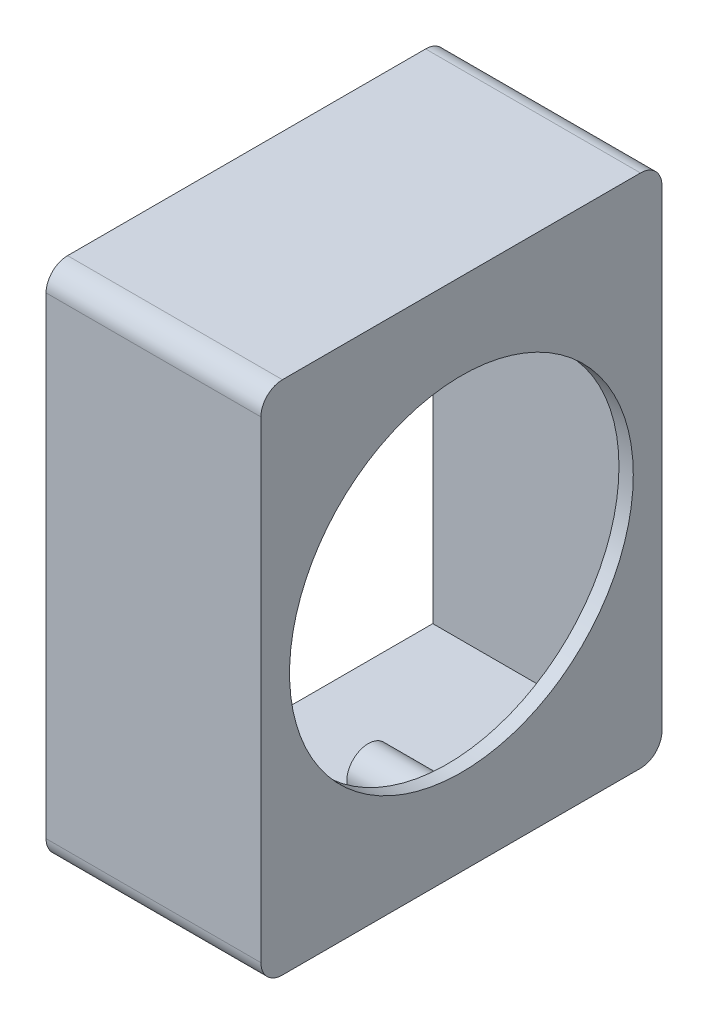
ISO-10303-21;
HEADER;
FILE_DESCRIPTION(('STEP AP214'),'2;1');
FILE_NAME('part.step','',(''),(''),'','','');
FILE_SCHEMA(('AUTOMOTIVE_DESIGN { 1 0 10303 214 1 1 1 1 }'));
ENDSEC;
DATA;
#1=APPLICATION_CONTEXT('core data for automotive mechanical design processes');
#2=APPLICATION_PROTOCOL_DEFINITION('international standard','automotive_design',2000,#1);
#3=PRODUCT_CONTEXT('',#1,'mechanical');
#4=PRODUCT('Part','Part','',(#3));
#5=PRODUCT_RELATED_PRODUCT_CATEGORY('part','',(#4));
#6=PRODUCT_DEFINITION_FORMATION('','',#4);
#7=PRODUCT_DEFINITION_CONTEXT('part definition',#1,'design');
#8=PRODUCT_DEFINITION('design','',#6,#7);
#9=PRODUCT_DEFINITION_SHAPE('','',#8);
#10=(LENGTH_UNIT() NAMED_UNIT(*) SI_UNIT(.MILLI.,.METRE.));
#11=(NAMED_UNIT(*) PLANE_ANGLE_UNIT() SI_UNIT($,.RADIAN.));
#12=(NAMED_UNIT(*) SI_UNIT($,.STERADIAN.) SOLID_ANGLE_UNIT());
#13=UNCERTAINTY_MEASURE_WITH_UNIT(LENGTH_MEASURE(1.E-05),#10,'distance_accuracy_value','');
#14=(GEOMETRIC_REPRESENTATION_CONTEXT(3) GLOBAL_UNCERTAINTY_ASSIGNED_CONTEXT((#13)) GLOBAL_UNIT_ASSIGNED_CONTEXT((#10,
#11,#12)) REPRESENTATION_CONTEXT('',''));
#15=CARTESIAN_POINT('',(0.,0.,0.));
#16=DIRECTION('',(0.,0.,1.));
#17=DIRECTION('',(1.,0.,0.));
#18=AXIS2_PLACEMENT_3D('',#15,#16,#17);
#19=CARTESIAN_POINT('',(0.,0.,0.));
#20=DIRECTION('',(-1.,0.,0.));
#21=DIRECTION('',(0.,0.,1.));
#22=AXIS2_PLACEMENT_3D('',#19,#20,#21);
#23=PLANE('',#22);
#24=CARTESIAN_POINT('',(0.,14.5,3.5));
#25=DIRECTION('',(-1.,0.,0.));
#26=DIRECTION('',(0.,0.,-1.));
#27=AXIS2_PLACEMENT_3D('',#24,#25,#26);
#28=CIRCLE('',#27,1.5);
#29=CARTESIAN_POINT('',(0.,14.5,2.));
#30=VERTEX_POINT('',#29);
#31=EDGE_CURVE('E274',#30,#30,#28,.T.);
#32=ORIENTED_EDGE('',*,*,#31,.F.);
#33=EDGE_LOOP('',(#32));
#34=FACE_BOUND('',#33,.T.);
#35=CARTESIAN_POINT('',(0.,-14.5,3.5));
#36=DIRECTION('',(-1.,0.,0.));
#37=DIRECTION('',(0.,0.,1.));
#38=AXIS2_PLACEMENT_3D('',#35,#36,#37);
#39=CIRCLE('',#38,1.5);
#40=CARTESIAN_POINT('',(0.,-14.5,5.));
#41=VERTEX_POINT('',#40);
#42=EDGE_CURVE('E11',#41,#41,#39,.T.);
#43=ORIENTED_EDGE('',*,*,#42,.F.);
#44=EDGE_LOOP('',(#43));
#45=FACE_BOUND('',#44,.T.);
#46=CARTESIAN_POINT('',(0.,0.,3.));
#47=DIRECTION('',(1.,0.,0.));
#48=DIRECTION('',(0.,0.,-1.));
#49=AXIS2_PLACEMENT_3D('',#46,#47,#48);
#50=CIRCLE('',#49,12.);
#51=CARTESIAN_POINT('',(0.,0.,-9.));
#52=VERTEX_POINT('',#51);
#53=EDGE_CURVE('E244',#52,#52,#50,.T.);
#54=ORIENTED_EDGE('',*,*,#53,.T.);
#55=EDGE_LOOP('',(#54));
#56=FACE_BOUND('',#55,.T.);
#57=DIRECTION('',(0.,0.,1.));
#58=VECTOR('',#57,1.);
#59=CARTESIAN_POINT('',(0.,17.,0.));
#60=LINE('',#59,#58);
#61=CARTESIAN_POINT('',(0.,17.,-10.));
#62=VERTEX_POINT('',#61);
#63=CARTESIAN_POINT('',(0.,17.,16.));
#64=VERTEX_POINT('',#63);
#65=EDGE_CURVE('E145',#62,#64,#60,.T.);
#66=ORIENTED_EDGE('',*,*,#65,.F.);
#67=DIRECTION('',(0.,1.,0.));
#68=VECTOR('',#67,1.);
#69=CARTESIAN_POINT('',(0.,-18.,-10.));
#70=LINE('',#69,#68);
#71=CARTESIAN_POINT('',(0.,-17.,-10.));
#72=VERTEX_POINT('',#71);
#73=EDGE_CURVE('E131',#72,#62,#70,.T.);
#74=ORIENTED_EDGE('',*,*,#73,.F.);
#75=DIRECTION('',(0.,0.,-1.));
#76=VECTOR('',#75,1.);
#77=CARTESIAN_POINT('',(0.,-17.,0.));
#78=LINE('',#77,#76);
#79=CARTESIAN_POINT('',(0.,-17.,16.));
#80=VERTEX_POINT('',#79);
#81=EDGE_CURVE('E144',#80,#72,#78,.T.);
#82=ORIENTED_EDGE('',*,*,#81,.F.);
#83=DIRECTION('',(0.,-1.,0.));
#84=VECTOR('',#83,1.);
#85=CARTESIAN_POINT('',(0.,0.,16.));
#86=LINE('',#85,#84);
#87=EDGE_CURVE('E152',#64,#80,#86,.T.);
#88=ORIENTED_EDGE('',*,*,#87,.F.);
#89=EDGE_LOOP('',(#66,#74,#82,#88));
#90=FACE_BOUND('',#89,.T.);
#91=ADVANCED_FACE('F39',(#34,#45,#56,#90),#23,.T.);
#92=CARTESIAN_POINT('',(-14.,17.,17.));
#93=DIRECTION('',(0.,-1.,0.));
#94=DIRECTION('',(0.,0.,-1.));
#95=AXIS2_PLACEMENT_3D('',#92,#93,#94);
#96=PLANE('',#95);
#97=DIRECTION('',(0.,0.,-1.));
#98=VECTOR('',#97,1.);
#99=CARTESIAN_POINT('',(-14.,17.,17.));
#100=LINE('',#99,#98);
#101=CARTESIAN_POINT('',(-14.,17.,16.));
#102=VERTEX_POINT('',#101);
#103=CARTESIAN_POINT('',(-14.,17.,-10.));
#104=VERTEX_POINT('',#103);
#105=EDGE_CURVE('E258',#102,#104,#100,.T.);
#106=ORIENTED_EDGE('',*,*,#105,.T.);
#107=DIRECTION('',(1.,0.,0.));
#108=VECTOR('',#107,1.);
#109=CARTESIAN_POINT('',(-14.,17.,-10.));
#110=LINE('',#109,#108);
#111=EDGE_CURVE('E138',#104,#62,#110,.T.);
#112=ORIENTED_EDGE('',*,*,#111,.T.);
#113=ORIENTED_EDGE('',*,*,#65,.T.);
#114=DIRECTION('',(1.,0.,0.));
#115=VECTOR('',#114,1.);
#116=CARTESIAN_POINT('',(-14.,17.,16.));
#117=LINE('',#116,#115);
#118=EDGE_CURVE('E239',#102,#64,#117,.T.);
#119=ORIENTED_EDGE('',*,*,#118,.F.);
#120=EDGE_LOOP('',(#106,#112,#113,#119));
#121=FACE_BOUND('',#120,.T.);
#122=ADVANCED_FACE('F298',(#121),#96,.T.);
#123=CARTESIAN_POINT('',(-14.,-17.,-17.));
#124=DIRECTION('',(0.,1.,0.));
#125=DIRECTION('',(0.,0.,1.));
#126=AXIS2_PLACEMENT_3D('',#123,#124,#125);
#127=PLANE('',#126);
#128=ORIENTED_EDGE('',*,*,#81,.T.);
#129=DIRECTION('',(-1.,0.,0.));
#130=VECTOR('',#129,1.);
#131=CARTESIAN_POINT('',(-14.,-17.,-10.));
#132=LINE('',#131,#130);
#133=CARTESIAN_POINT('',(-14.,-17.,-10.));
#134=VERTEX_POINT('',#133);
#135=EDGE_CURVE('E128',#72,#134,#132,.T.);
#136=ORIENTED_EDGE('',*,*,#135,.T.);
#137=DIRECTION('',(0.,0.,1.));
#138=VECTOR('',#137,1.);
#139=CARTESIAN_POINT('',(-14.,-17.,-17.));
#140=LINE('',#139,#138);
#141=CARTESIAN_POINT('',(-14.,-17.,16.));
#142=VERTEX_POINT('',#141);
#143=EDGE_CURVE('E228',#134,#142,#140,.T.);
#144=ORIENTED_EDGE('',*,*,#143,.T.);
#145=DIRECTION('',(1.,0.,0.));
#146=VECTOR('',#145,1.);
#147=CARTESIAN_POINT('',(-14.,-17.,16.));
#148=LINE('',#147,#146);
#149=EDGE_CURVE('E151',#142,#80,#148,.T.);
#150=ORIENTED_EDGE('',*,*,#149,.T.);
#151=EDGE_LOOP('',(#128,#136,#144,#150));
#152=FACE_BOUND('',#151,.T.);
#153=ADVANCED_FACE('F149',(#152),#127,.T.);
#154=CARTESIAN_POINT('',(1.,18.,17.));
#155=DIRECTION('',(0.,1.,0.));
#156=DIRECTION('',(0.,0.,1.));
#157=AXIS2_PLACEMENT_3D('',#154,#155,#156);
#158=PLANE('',#157);
#159=DIRECTION('',(0.,0.,-1.));
#160=VECTOR('',#159,1.);
#161=CARTESIAN_POINT('',(-14.,18.,17.));
#162=LINE('',#161,#160);
#163=CARTESIAN_POINT('',(-14.,18.,15.5));
#164=VERTEX_POINT('',#163);
#165=CARTESIAN_POINT('',(-14.,18.,-9.5));
#166=VERTEX_POINT('',#165);
#167=EDGE_CURVE('E233',#164,#166,#162,.T.);
#168=ORIENTED_EDGE('',*,*,#167,.F.);
#169=DIRECTION('',(-1.,0.,0.));
#170=VECTOR('',#169,1.);
#171=CARTESIAN_POINT('',(1.,18.,15.5));
#172=LINE('',#171,#170);
#173=CARTESIAN_POINT('',(1.,18.,15.5));
#174=VERTEX_POINT('',#173);
#175=EDGE_CURVE('E61',#164,#174,#172,.F.);
#176=ORIENTED_EDGE('',*,*,#175,.T.);
#177=DIRECTION('',(0.,0.,-1.));
#178=VECTOR('',#177,1.);
#179=CARTESIAN_POINT('',(1.,18.,17.));
#180=LINE('',#179,#178);
#181=CARTESIAN_POINT('',(1.,18.,-9.5));
#182=VERTEX_POINT('',#181);
#183=EDGE_CURVE('E247',#174,#182,#180,.T.);
#184=ORIENTED_EDGE('',*,*,#183,.T.);
#185=DIRECTION('',(1.,0.,0.));
#186=VECTOR('',#185,1.);
#187=CARTESIAN_POINT('',(-14.,18.,-9.5));
#188=LINE('',#187,#186);
#189=EDGE_CURVE('E191',#182,#166,#188,.F.);
#190=ORIENTED_EDGE('',*,*,#189,.T.);
#191=EDGE_LOOP('',(#168,#176,#184,#190));
#192=FACE_BOUND('',#191,.T.);
#193=ADVANCED_FACE('F256',(#192),#158,.T.);
#194=CARTESIAN_POINT('',(1.,-18.,17.));
#195=DIRECTION('',(0.,0.,1.));
#196=DIRECTION('',(1.,0.,0.));
#197=AXIS2_PLACEMENT_3D('',#194,#195,#196);
#198=PLANE('',#197);
#199=DIRECTION('',(0.,1.,0.));
#200=VECTOR('',#199,1.);
#201=CARTESIAN_POINT('',(-14.,-18.,17.));
#202=LINE('',#201,#200);
#203=CARTESIAN_POINT('',(-14.,-16.5,17.));
#204=VERTEX_POINT('',#203);
#205=CARTESIAN_POINT('',(-14.,16.5,17.));
#206=VERTEX_POINT('',#205);
#207=EDGE_CURVE('E229',#204,#206,#202,.T.);
#208=ORIENTED_EDGE('',*,*,#207,.F.);
#209=DIRECTION('',(-1.,0.,0.));
#210=VECTOR('',#209,1.);
#211=CARTESIAN_POINT('',(1.,-16.5,17.));
#212=LINE('',#211,#210);
#213=CARTESIAN_POINT('',(1.,-16.5,17.));
#214=VERTEX_POINT('',#213);
#215=EDGE_CURVE('E182',#204,#214,#212,.F.);
#216=ORIENTED_EDGE('',*,*,#215,.T.);
#217=DIRECTION('',(0.,1.,0.));
#218=VECTOR('',#217,1.);
#219=CARTESIAN_POINT('',(1.,-18.,17.));
#220=LINE('',#219,#218);
#221=CARTESIAN_POINT('',(1.,16.5,17.));
#222=VERTEX_POINT('',#221);
#223=EDGE_CURVE('E157',#214,#222,#220,.T.);
#224=ORIENTED_EDGE('',*,*,#223,.T.);
#225=DIRECTION('',(-1.,0.,0.));
#226=VECTOR('',#225,1.);
#227=CARTESIAN_POINT('',(1.,16.5,17.));
#228=LINE('',#227,#226);
#229=EDGE_CURVE('E179',#222,#206,#228,.T.);
#230=ORIENTED_EDGE('',*,*,#229,.T.);
#231=EDGE_LOOP('',(#208,#216,#224,#230));
#232=FACE_BOUND('',#231,.T.);
#233=ADVANCED_FACE('F252',(#232),#198,.T.);
#234=CARTESIAN_POINT('',(1.,-18.,17.));
#235=DIRECTION('',(0.,1.,0.));
#236=DIRECTION('',(0.,0.,1.));
#237=AXIS2_PLACEMENT_3D('',#234,#235,#236);
#238=PLANE('',#237);
#239=DIRECTION('',(0.,0.,-1.));
#240=VECTOR('',#239,1.);
#241=CARTESIAN_POINT('',(1.,-18.,17.));
#242=LINE('',#241,#240);
#243=CARTESIAN_POINT('',(1.,-18.,15.5));
#244=VERTEX_POINT('',#243);
#245=CARTESIAN_POINT('',(1.,-18.,-9.5));
#246=VERTEX_POINT('',#245);
#247=EDGE_CURVE('E153',#244,#246,#242,.T.);
#248=ORIENTED_EDGE('',*,*,#247,.F.);
#249=DIRECTION('',(-1.,0.,0.));
#250=VECTOR('',#249,1.);
#251=CARTESIAN_POINT('',(-14.,-18.,15.5));
#252=LINE('',#251,#250);
#253=CARTESIAN_POINT('',(-14.,-18.,15.5));
#254=VERTEX_POINT('',#253);
#255=EDGE_CURVE('E168',#244,#254,#252,.T.);
#256=ORIENTED_EDGE('',*,*,#255,.T.);
#257=DIRECTION('',(0.,0.,1.));
#258=VECTOR('',#257,1.);
#259=CARTESIAN_POINT('',(-14.,-18.,-17.));
#260=LINE('',#259,#258);
#261=CARTESIAN_POINT('',(-14.,-18.,-9.5));
#262=VERTEX_POINT('',#261);
#263=EDGE_CURVE('E218',#262,#254,#260,.T.);
#264=ORIENTED_EDGE('',*,*,#263,.F.);
#265=DIRECTION('',(1.,0.,0.));
#266=VECTOR('',#265,1.);
#267=CARTESIAN_POINT('',(1.,-18.,-9.5));
#268=LINE('',#267,#266);
#269=EDGE_CURVE('E165',#262,#246,#268,.T.);
#270=ORIENTED_EDGE('',*,*,#269,.T.);
#271=EDGE_LOOP('',(#248,#256,#264,#270));
#272=FACE_BOUND('',#271,.T.);
#273=ADVANCED_FACE('F216',(#272),#238,.F.);
#274=CARTESIAN_POINT('',(1.,0.,0.));
#275=DIRECTION('',(-1.,0.,0.));
#276=DIRECTION('',(0.,0.,1.));
#277=AXIS2_PLACEMENT_3D('',#274,#275,#276);
#278=PLANE('',#277);
#279=CARTESIAN_POINT('',(1.,0.,3.));
#280=DIRECTION('',(1.,0.,0.));
#281=DIRECTION('',(0.,0.,-1.));
#282=AXIS2_PLACEMENT_3D('',#279,#280,#281);
#283=CIRCLE('',#282,12.);
#284=CARTESIAN_POINT('',(1.,0.,-9.));
#285=VERTEX_POINT('',#284);
#286=EDGE_CURVE('E242',#285,#285,#283,.T.);
#287=ORIENTED_EDGE('',*,*,#286,.F.);
#288=EDGE_LOOP('',(#287));
#289=FACE_BOUND('',#288,.T.);
#290=ORIENTED_EDGE('',*,*,#223,.F.);
#291=CARTESIAN_POINT('',(1.,-16.5,15.5));
#292=DIRECTION('',(-1.,0.,0.));
#293=DIRECTION('',(0.,0.,1.));
#294=AXIS2_PLACEMENT_3D('',#291,#292,#293);
#295=CIRCLE('',#294,1.5);
#296=EDGE_CURVE('E189',#214,#244,#295,.F.);
#297=ORIENTED_EDGE('',*,*,#296,.T.);
#298=ORIENTED_EDGE('',*,*,#247,.T.);
#299=CARTESIAN_POINT('',(1.,-16.5,-9.5));
#300=DIRECTION('',(-1.,0.,0.));
#301=DIRECTION('',(0.,0.,1.));
#302=AXIS2_PLACEMENT_3D('',#299,#300,#301);
#303=CIRCLE('',#302,1.5);
#304=CARTESIAN_POINT('',(1.,-16.5,-11.));
#305=VERTEX_POINT('',#304);
#306=EDGE_CURVE('E185',#246,#305,#303,.F.);
#307=ORIENTED_EDGE('',*,*,#306,.T.);
#308=DIRECTION('',(0.,-1.,0.));
#309=VECTOR('',#308,1.);
#310=CARTESIAN_POINT('',(1.,-24.056889751143,-11.));
#311=LINE('',#310,#309);
#312=CARTESIAN_POINT('',(1.,16.5,-11.));
#313=VERTEX_POINT('',#312);
#314=EDGE_CURVE('E202',#313,#305,#311,.T.);
#315=ORIENTED_EDGE('',*,*,#314,.F.);
#316=CARTESIAN_POINT('',(1.,16.5,-9.5));
#317=DIRECTION('',(-1.,0.,0.));
#318=DIRECTION('',(0.,0.,1.));
#319=AXIS2_PLACEMENT_3D('',#316,#317,#318);
#320=CIRCLE('',#319,1.5);
#321=EDGE_CURVE('E54',#313,#182,#320,.F.);
#322=ORIENTED_EDGE('',*,*,#321,.T.);
#323=ORIENTED_EDGE('',*,*,#183,.F.);
#324=CARTESIAN_POINT('',(1.,16.5,15.5));
#325=DIRECTION('',(-1.,0.,0.));
#326=DIRECTION('',(0.,0.,1.));
#327=AXIS2_PLACEMENT_3D('',#324,#325,#326);
#328=CIRCLE('',#327,1.5);
#329=EDGE_CURVE('E187',#174,#222,#328,.F.);
#330=ORIENTED_EDGE('',*,*,#329,.T.);
#331=EDGE_LOOP('',(#290,#297,#298,#307,#315,#322,#323,#330));
#332=FACE_BOUND('',#331,.T.);
#333=ADVANCED_FACE('F220',(#289,#332),#278,.F.);
#334=CARTESIAN_POINT('',(0.,0.,3.));
#335=DIRECTION('',(1.,0.,0.));
#336=DIRECTION('',(0.,0.,-1.));
#337=AXIS2_PLACEMENT_3D('',#334,#335,#336);
#338=CYLINDRICAL_SURFACE('',#337,12.);
#339=ORIENTED_EDGE('',*,*,#53,.F.);
#340=EDGE_LOOP('',(#339));
#341=FACE_BOUND('',#340,.T.);
#342=ORIENTED_EDGE('',*,*,#286,.T.);
#343=EDGE_LOOP('',(#342));
#344=FACE_BOUND('',#343,.T.);
#345=ADVANCED_FACE('F352',(#341,#344),#338,.F.);
#346=CARTESIAN_POINT('',(-14.,-18.,16.));
#347=DIRECTION('',(0.,0.,-1.));
#348=DIRECTION('',(-1.,0.,0.));
#349=AXIS2_PLACEMENT_3D('',#346,#347,#348);
#350=PLANE('',#349);
#351=ORIENTED_EDGE('',*,*,#118,.T.);
#352=ORIENTED_EDGE('',*,*,#87,.T.);
#353=ORIENTED_EDGE('',*,*,#149,.F.);
#354=DIRECTION('',(0.,1.,0.));
#355=VECTOR('',#354,1.);
#356=CARTESIAN_POINT('',(-14.,-18.,16.));
#357=LINE('',#356,#355);
#358=EDGE_CURVE('E231',#142,#102,#357,.T.);
#359=ORIENTED_EDGE('',*,*,#358,.T.);
#360=EDGE_LOOP('',(#351,#352,#353,#359));
#361=FACE_BOUND('',#360,.T.);
#362=ADVANCED_FACE('F349',(#361),#350,.T.);
#363=CARTESIAN_POINT('',(-14.,0.,0.));
#364=DIRECTION('',(-1.,0.,0.));
#365=DIRECTION('',(0.,0.,1.));
#366=AXIS2_PLACEMENT_3D('',#363,#364,#365);
#367=PLANE('',#366);
#368=ORIENTED_EDGE('',*,*,#263,.T.);
#369=CARTESIAN_POINT('',(-14.,-16.5,15.5));
#370=DIRECTION('',(-1.,0.,0.));
#371=DIRECTION('',(0.,0.,1.));
#372=AXIS2_PLACEMENT_3D('',#369,#370,#371);
#373=CIRCLE('',#372,1.5);
#374=EDGE_CURVE('E177',#254,#204,#373,.T.);
#375=ORIENTED_EDGE('',*,*,#374,.T.);
#376=ORIENTED_EDGE('',*,*,#207,.T.);
#377=CARTESIAN_POINT('',(-14.,16.5,15.5));
#378=DIRECTION('',(-1.,0.,0.));
#379=DIRECTION('',(0.,0.,1.));
#380=AXIS2_PLACEMENT_3D('',#377,#378,#379);
#381=CIRCLE('',#380,1.5);
#382=EDGE_CURVE('E175',#206,#164,#381,.T.);
#383=ORIENTED_EDGE('',*,*,#382,.T.);
#384=ORIENTED_EDGE('',*,*,#167,.T.);
#385=CARTESIAN_POINT('',(-14.,16.5,-9.5));
#386=DIRECTION('',(-1.,0.,0.));
#387=DIRECTION('',(0.,0.,1.));
#388=AXIS2_PLACEMENT_3D('',#385,#386,#387);
#389=CIRCLE('',#388,1.5);
#390=CARTESIAN_POINT('',(-14.,16.5,-11.));
#391=VERTEX_POINT('',#390);
#392=EDGE_CURVE('E171',#166,#391,#389,.T.);
#393=ORIENTED_EDGE('',*,*,#392,.T.);
#394=DIRECTION('',(0.,1.,0.));
#395=VECTOR('',#394,1.);
#396=CARTESIAN_POINT('',(-14.,0.,-11.));
#397=LINE('',#396,#395);
#398=CARTESIAN_POINT('',(-14.,-16.5,-11.));
#399=VERTEX_POINT('',#398);
#400=EDGE_CURVE('E162',#399,#391,#397,.T.);
#401=ORIENTED_EDGE('',*,*,#400,.F.);
#402=CARTESIAN_POINT('',(-14.,-16.5,-9.5));
#403=DIRECTION('',(-1.,0.,0.));
#404=DIRECTION('',(0.,0.,1.));
#405=AXIS2_PLACEMENT_3D('',#402,#403,#404);
#406=CIRCLE('',#405,1.5);
#407=EDGE_CURVE('E173',#399,#262,#406,.T.);
#408=ORIENTED_EDGE('',*,*,#407,.T.);
#409=EDGE_LOOP('',(#368,#375,#376,#383,#384,#393,#401,#408));
#410=FACE_BOUND('',#409,.T.);
#411=DIRECTION('',(0.,1.,0.));
#412=VECTOR('',#411,1.);
#413=CARTESIAN_POINT('',(-14.,-18.,-10.));
#414=LINE('',#413,#412);
#415=EDGE_CURVE('E134',#134,#104,#414,.T.);
#416=ORIENTED_EDGE('',*,*,#415,.T.);
#417=ORIENTED_EDGE('',*,*,#105,.F.);
#418=ORIENTED_EDGE('',*,*,#358,.F.);
#419=ORIENTED_EDGE('',*,*,#143,.F.);
#420=EDGE_LOOP('',(#416,#417,#418,#419));
#421=FACE_BOUND('',#420,.T.);
#422=ADVANCED_FACE('F207',(#410,#421),#367,.T.);
#423=CARTESIAN_POINT('',(-14.,-24.056889751143,-11.));
#424=DIRECTION('',(0.,0.,1.));
#425=DIRECTION('',(1.,0.,0.));
#426=AXIS2_PLACEMENT_3D('',#423,#424,#425);
#427=PLANE('',#426);
#428=ORIENTED_EDGE('',*,*,#314,.T.);
#429=DIRECTION('',(1.,0.,0.));
#430=VECTOR('',#429,1.);
#431=CARTESIAN_POINT('',(-14.,-16.5,-11.));
#432=LINE('',#431,#430);
#433=EDGE_CURVE('E47',#305,#399,#432,.F.);
#434=ORIENTED_EDGE('',*,*,#433,.T.);
#435=ORIENTED_EDGE('',*,*,#400,.T.);
#436=DIRECTION('',(1.,0.,0.));
#437=VECTOR('',#436,1.);
#438=CARTESIAN_POINT('',(1.,16.5,-11.));
#439=LINE('',#438,#437);
#440=EDGE_CURVE('E194',#391,#313,#439,.T.);
#441=ORIENTED_EDGE('',*,*,#440,.T.);
#442=EDGE_LOOP('',(#428,#434,#435,#441));
#443=FACE_BOUND('',#442,.T.);
#444=ADVANCED_FACE('F200',(#443),#427,.F.);
#445=CARTESIAN_POINT('',(-14.,-18.,-10.));
#446=DIRECTION('',(0.,0.,-1.));
#447=DIRECTION('',(-1.,0.,0.));
#448=AXIS2_PLACEMENT_3D('',#445,#446,#447);
#449=PLANE('',#448);
#450=ORIENTED_EDGE('',*,*,#111,.F.);
#451=ORIENTED_EDGE('',*,*,#415,.F.);
#452=ORIENTED_EDGE('',*,*,#135,.F.);
#453=ORIENTED_EDGE('',*,*,#73,.T.);
#454=EDGE_LOOP('',(#450,#451,#452,#453));
#455=FACE_BOUND('',#454,.T.);
#456=ADVANCED_FACE('F130',(#455),#449,.F.);
#457=CARTESIAN_POINT('',(1.,-16.5,15.5));
#458=DIRECTION('',(1.,0.,0.));
#459=DIRECTION('',(0.,0.,-1.));
#460=AXIS2_PLACEMENT_3D('',#457,#458,#459);
#461=CYLINDRICAL_SURFACE('',#460,1.5);
#462=ORIENTED_EDGE('',*,*,#296,.F.);
#463=ORIENTED_EDGE('',*,*,#215,.F.);
#464=ORIENTED_EDGE('',*,*,#374,.F.);
#465=ORIENTED_EDGE('',*,*,#255,.F.);
#466=EDGE_LOOP('',(#462,#463,#464,#465));
#467=FACE_BOUND('',#466,.T.);
#468=ADVANCED_FACE('F225',(#467),#461,.T.);
#469=CARTESIAN_POINT('',(1.,16.5,15.5));
#470=DIRECTION('',(-1.,0.,0.));
#471=DIRECTION('',(0.,0.,1.));
#472=AXIS2_PLACEMENT_3D('',#469,#470,#471);
#473=CYLINDRICAL_SURFACE('',#472,1.5);
#474=ORIENTED_EDGE('',*,*,#329,.F.);
#475=ORIENTED_EDGE('',*,*,#175,.F.);
#476=ORIENTED_EDGE('',*,*,#382,.F.);
#477=ORIENTED_EDGE('',*,*,#229,.F.);
#478=EDGE_LOOP('',(#474,#475,#476,#477));
#479=FACE_BOUND('',#478,.T.);
#480=ADVANCED_FACE('F255',(#479),#473,.T.);
#481=CARTESIAN_POINT('',(1.,-16.5,-9.5));
#482=DIRECTION('',(1.,0.,0.));
#483=DIRECTION('',(0.,0.,-1.));
#484=AXIS2_PLACEMENT_3D('',#481,#482,#483);
#485=CYLINDRICAL_SURFACE('',#484,1.5);
#486=ORIENTED_EDGE('',*,*,#407,.F.);
#487=ORIENTED_EDGE('',*,*,#433,.F.);
#488=ORIENTED_EDGE('',*,*,#306,.F.);
#489=ORIENTED_EDGE('',*,*,#269,.F.);
#490=EDGE_LOOP('',(#486,#487,#488,#489));
#491=FACE_BOUND('',#490,.T.);
#492=ADVANCED_FACE('F213',(#491),#485,.T.);
#493=CARTESIAN_POINT('',(-14.,16.5,-9.5));
#494=DIRECTION('',(-1.,0.,0.));
#495=DIRECTION('',(0.,0.,1.));
#496=AXIS2_PLACEMENT_3D('',#493,#494,#495);
#497=CYLINDRICAL_SURFACE('',#496,1.5);
#498=ORIENTED_EDGE('',*,*,#392,.F.);
#499=ORIENTED_EDGE('',*,*,#189,.F.);
#500=ORIENTED_EDGE('',*,*,#321,.F.);
#501=ORIENTED_EDGE('',*,*,#440,.F.);
#502=EDGE_LOOP('',(#498,#499,#500,#501));
#503=FACE_BOUND('',#502,.T.);
#504=ADVANCED_FACE('F41',(#503),#497,.T.);
#505=CARTESIAN_POINT('',(-5.,-14.5,3.5));
#506=DIRECTION('',(1.,0.,0.));
#507=DIRECTION('',(0.,0.,-1.));
#508=AXIS2_PLACEMENT_3D('',#505,#506,#507);
#509=CYLINDRICAL_SURFACE('',#508,1.5);
#510=CARTESIAN_POINT('',(-5.,-14.5,3.5));
#511=DIRECTION('',(1.,0.,0.));
#512=DIRECTION('',(0.,0.,-1.));
#513=AXIS2_PLACEMENT_3D('',#510,#511,#512);
#514=CIRCLE('',#513,1.5);
#515=CARTESIAN_POINT('',(-5.,-14.5,2.));
#516=VERTEX_POINT('',#515);
#517=EDGE_CURVE('E146',#516,#516,#514,.T.);
#518=ORIENTED_EDGE('',*,*,#517,.T.);
#519=EDGE_LOOP('',(#518));
#520=FACE_BOUND('',#519,.T.);
#521=ORIENTED_EDGE('',*,*,#42,.T.);
#522=EDGE_LOOP('',(#521));
#523=FACE_BOUND('',#522,.T.);
#524=ADVANCED_FACE('F326',(#520,#523),#509,.T.);
#525=CARTESIAN_POINT('',(-5.,-14.5,3.5));
#526=DIRECTION('',(1.,0.,0.));
#527=DIRECTION('',(0.,0.,-1.));
#528=AXIS2_PLACEMENT_3D('',#525,#526,#527);
#529=PLANE('',#528);
#530=CARTESIAN_POINT('',(-5.,-14.5,3.5));
#531=DIRECTION('',(-1.,0.,0.));
#532=DIRECTION('',(0.,0.,1.));
#533=AXIS2_PLACEMENT_3D('',#530,#531,#532);
#534=CIRCLE('',#533,1.);
#535=CARTESIAN_POINT('',(-5.,-14.5,4.5));
#536=VERTEX_POINT('',#535);
#537=EDGE_CURVE('E268',#536,#536,#534,.T.);
#538=ORIENTED_EDGE('',*,*,#537,.F.);
#539=EDGE_LOOP('',(#538));
#540=FACE_BOUND('',#539,.T.);
#541=ORIENTED_EDGE('',*,*,#517,.F.);
#542=EDGE_LOOP('',(#541));
#543=FACE_BOUND('',#542,.T.);
#544=ADVANCED_FACE('F331',(#540,#543),#529,.F.);
#545=CARTESIAN_POINT('',(0.,-14.5,3.5));
#546=DIRECTION('',(-1.,0.,0.));
#547=DIRECTION('',(0.,0.,1.));
#548=AXIS2_PLACEMENT_3D('',#545,#546,#547);
#549=CYLINDRICAL_SURFACE('',#548,1.);
#550=CARTESIAN_POINT('',(0.,-14.5,3.5));
#551=DIRECTION('',(-1.,0.,0.));
#552=DIRECTION('',(0.,0.,1.));
#553=AXIS2_PLACEMENT_3D('',#550,#551,#552);
#554=CIRCLE('',#553,1.);
#555=CARTESIAN_POINT('',(0.,-14.5,4.5));
#556=VERTEX_POINT('',#555);
#557=EDGE_CURVE('E267',#556,#556,#554,.T.);
#558=ORIENTED_EDGE('',*,*,#557,.F.);
#559=EDGE_LOOP('',(#558));
#560=FACE_BOUND('',#559,.T.);
#561=ORIENTED_EDGE('',*,*,#537,.T.);
#562=EDGE_LOOP('',(#561));
#563=FACE_BOUND('',#562,.T.);
#564=ADVANCED_FACE('F337',(#560,#563),#549,.F.);
#565=CARTESIAN_POINT('',(0.,-14.5,3.5));
#566=DIRECTION('',(-1.,0.,0.));
#567=DIRECTION('',(0.,0.,1.));
#568=AXIS2_PLACEMENT_3D('',#565,#566,#567);
#569=PLANE('',#568);
#570=ORIENTED_EDGE('',*,*,#557,.T.);
#571=EDGE_LOOP('',(#570));
#572=FACE_BOUND('',#571,.T.);
#573=ADVANCED_FACE('F420',(#572),#569,.T.);
#574=CARTESIAN_POINT('',(-5.,14.5,3.5));
#575=DIRECTION('',(1.,0.,0.));
#576=DIRECTION('',(0.,0.,-1.));
#577=AXIS2_PLACEMENT_3D('',#574,#575,#576);
#578=CYLINDRICAL_SURFACE('',#577,1.5);
#579=CARTESIAN_POINT('',(-5.,14.5,3.5));
#580=DIRECTION('',(-1.,0.,0.));
#581=DIRECTION('',(0.,0.,-1.));
#582=AXIS2_PLACEMENT_3D('',#579,#580,#581);
#583=CIRCLE('',#582,1.5);
#584=CARTESIAN_POINT('',(-5.,14.5,2.));
#585=VERTEX_POINT('',#584);
#586=EDGE_CURVE('E271',#585,#585,#583,.T.);
#587=ORIENTED_EDGE('',*,*,#586,.F.);
#588=EDGE_LOOP('',(#587));
#589=FACE_BOUND('',#588,.T.);
#590=ORIENTED_EDGE('',*,*,#31,.T.);
#591=EDGE_LOOP('',(#590));
#592=FACE_BOUND('',#591,.T.);
#593=ADVANCED_FACE('F428',(#589,#592),#578,.T.);
#594=CARTESIAN_POINT('',(-5.,14.5,3.5));
#595=DIRECTION('',(1.,0.,0.));
#596=DIRECTION('',(0.,0.,-1.));
#597=AXIS2_PLACEMENT_3D('',#594,#595,#596);
#598=PLANE('',#597);
#599=CARTESIAN_POINT('',(-5.,14.5,3.5));
#600=DIRECTION('',(1.,0.,0.));
#601=DIRECTION('',(0.,0.,1.));
#602=AXIS2_PLACEMENT_3D('',#599,#600,#601);
#603=CIRCLE('',#602,1.);
#604=CARTESIAN_POINT('',(-5.,14.5,4.5));
#605=VERTEX_POINT('',#604);
#606=EDGE_CURVE('E280',#605,#605,#603,.T.);
#607=ORIENTED_EDGE('',*,*,#606,.T.);
#608=EDGE_LOOP('',(#607));
#609=FACE_BOUND('',#608,.T.);
#610=ORIENTED_EDGE('',*,*,#586,.T.);
#611=EDGE_LOOP('',(#610));
#612=FACE_BOUND('',#611,.T.);
#613=ADVANCED_FACE('F295',(#609,#612),#598,.F.);
#614=CARTESIAN_POINT('',(0.,14.5,3.5));
#615=DIRECTION('',(-1.,0.,0.));
#616=DIRECTION('',(0.,0.,1.));
#617=AXIS2_PLACEMENT_3D('',#614,#615,#616);
#618=CYLINDRICAL_SURFACE('',#617,1.);
#619=CARTESIAN_POINT('',(0.,14.5,3.5));
#620=DIRECTION('',(1.,0.,0.));
#621=DIRECTION('',(0.,0.,1.));
#622=AXIS2_PLACEMENT_3D('',#619,#620,#621);
#623=CIRCLE('',#622,1.);
#624=CARTESIAN_POINT('',(0.,14.5,4.5));
#625=VERTEX_POINT('',#624);
#626=EDGE_CURVE('E277',#625,#625,#623,.T.);
#627=ORIENTED_EDGE('',*,*,#626,.T.);
#628=EDGE_LOOP('',(#627));
#629=FACE_BOUND('',#628,.T.);
#630=ORIENTED_EDGE('',*,*,#606,.F.);
#631=EDGE_LOOP('',(#630));
#632=FACE_BOUND('',#631,.T.);
#633=ADVANCED_FACE('F286',(#629,#632),#618,.F.);
#634=CARTESIAN_POINT('',(0.,14.5,3.5));
#635=DIRECTION('',(-1.,0.,0.));
#636=DIRECTION('',(0.,0.,1.));
#637=AXIS2_PLACEMENT_3D('',#634,#635,#636);
#638=PLANE('',#637);
#639=ORIENTED_EDGE('',*,*,#626,.F.);
#640=EDGE_LOOP('',(#639));
#641=FACE_BOUND('',#640,.T.);
#642=ADVANCED_FACE('F289',(#641),#638,.T.);
#643=CLOSED_SHELL('',(#91,#122,#153,#193,#233,#273,#333,#345,#362,#422,#444,#456,#468,#480,#492,
#504,#524,#544,#564,#573,#593,#613,#633,#642));
#644=MANIFOLD_SOLID_BREP('B2',#643);
#645=ADVANCED_BREP_SHAPE_REPRESENTATION('',(#18,#644),#14);
#646=SHAPE_DEFINITION_REPRESENTATION(#9,#645);
ENDSEC;
END-ISO-10303-21;
